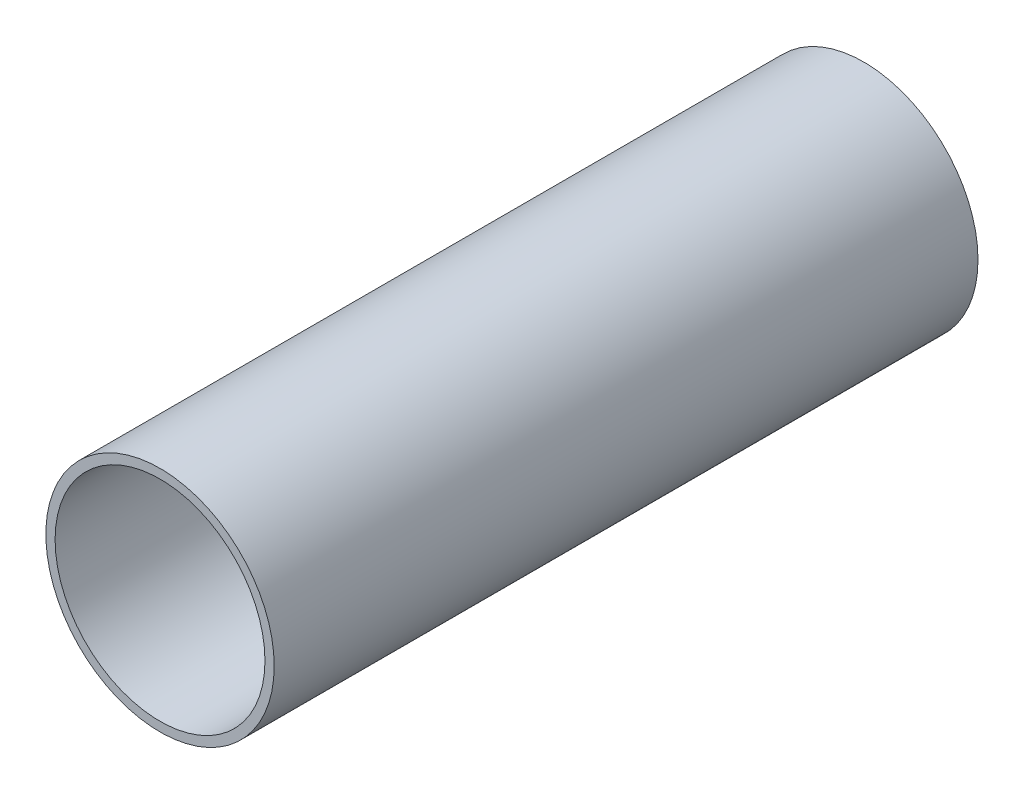
ISO-10303-21;
HEADER;
FILE_DESCRIPTION(('STEP AP214'),'2;1');
FILE_NAME('part.step','',(''),(''),'','','');
FILE_SCHEMA(('AUTOMOTIVE_DESIGN { 1 0 10303 214 1 1 1 1 }'));
ENDSEC;
DATA;
#1=APPLICATION_CONTEXT('core data for automotive mechanical design processes');
#2=APPLICATION_PROTOCOL_DEFINITION('international standard','automotive_design',2000,#1);
#3=PRODUCT_CONTEXT('',#1,'mechanical');
#4=PRODUCT('Part','Part','',(#3));
#5=PRODUCT_RELATED_PRODUCT_CATEGORY('part','',(#4));
#6=PRODUCT_DEFINITION_FORMATION('','',#4);
#7=PRODUCT_DEFINITION_CONTEXT('part definition',#1,'design');
#8=PRODUCT_DEFINITION('design','',#6,#7);
#9=PRODUCT_DEFINITION_SHAPE('','',#8);
#10=(LENGTH_UNIT() NAMED_UNIT(*) SI_UNIT(.MILLI.,.METRE.));
#11=(NAMED_UNIT(*) PLANE_ANGLE_UNIT() SI_UNIT($,.RADIAN.));
#12=(NAMED_UNIT(*) SI_UNIT($,.STERADIAN.) SOLID_ANGLE_UNIT());
#13=UNCERTAINTY_MEASURE_WITH_UNIT(LENGTH_MEASURE(1.E-05),#10,'distance_accuracy_value','');
#14=(GEOMETRIC_REPRESENTATION_CONTEXT(3) GLOBAL_UNCERTAINTY_ASSIGNED_CONTEXT((#13)) GLOBAL_UNIT_ASSIGNED_CONTEXT((#10,
#11,#12)) REPRESENTATION_CONTEXT('',''));
#15=CARTESIAN_POINT('',(0.,0.,0.));
#16=DIRECTION('',(0.,0.,1.));
#17=DIRECTION('',(1.,0.,0.));
#18=AXIS2_PLACEMENT_3D('',#15,#16,#17);
#19=CARTESIAN_POINT('',(0.,0.,53.229999919));
#20=DIRECTION('',(0.,0.,1.));
#21=DIRECTION('',(1.,0.,0.));
#22=AXIS2_PLACEMENT_3D('',#19,#20,#21);
#23=PLANE('',#22);
#24=CARTESIAN_POINT('',(0.,0.,53.229999919));
#25=DIRECTION('',(0.,0.,1.));
#26=DIRECTION('',(1.,0.,0.));
#27=AXIS2_PLACEMENT_3D('',#24,#25,#26);
#28=CIRCLE('',#27,17.272);
#29=CARTESIAN_POINT('',(17.272,0.,53.229999919));
#30=VERTEX_POINT('',#29);
#31=EDGE_CURVE('E10',#30,#30,#28,.T.);
#32=ORIENTED_EDGE('',*,*,#31,.T.);
#33=EDGE_LOOP('',(#32));
#34=FACE_BOUND('',#33,.T.);
#35=CARTESIAN_POINT('',(0.,0.,53.229999919));
#36=DIRECTION('',(0.,0.,1.));
#37=DIRECTION('',(1.,0.,0.));
#38=AXIS2_PLACEMENT_3D('',#35,#36,#37);
#39=CIRCLE('',#38,15.875);
#40=CARTESIAN_POINT('',(15.875,0.,53.229999919));
#41=VERTEX_POINT('',#40);
#42=EDGE_CURVE('E51',#41,#41,#39,.T.);
#43=ORIENTED_EDGE('',*,*,#42,.F.);
#44=EDGE_LOOP('',(#43));
#45=FACE_BOUND('',#44,.T.);
#46=ADVANCED_FACE('F43',(#34,#45),#23,.T.);
#47=CARTESIAN_POINT('',(0.,0.,53.229999919));
#48=DIRECTION('',(0.,0.,-1.));
#49=DIRECTION('',(-1.,0.,0.));
#50=AXIS2_PLACEMENT_3D('',#47,#48,#49);
#51=CYLINDRICAL_SURFACE('',#50,17.272);
#52=ORIENTED_EDGE('',*,*,#31,.F.);
#53=EDGE_LOOP('',(#52));
#54=FACE_BOUND('',#53,.T.);
#55=CARTESIAN_POINT('',(0.,0.,-53.229999919));
#56=DIRECTION('',(0.,0.,1.));
#57=DIRECTION('',(1.,0.,0.));
#58=AXIS2_PLACEMENT_3D('',#55,#56,#57);
#59=CIRCLE('',#58,17.272);
#60=CARTESIAN_POINT('',(17.272,0.,-53.229999919));
#61=VERTEX_POINT('',#60);
#62=EDGE_CURVE('E56',#61,#61,#59,.T.);
#63=ORIENTED_EDGE('',*,*,#62,.T.);
#64=EDGE_LOOP('',(#63));
#65=FACE_BOUND('',#64,.T.);
#66=ADVANCED_FACE('F45',(#54,#65),#51,.T.);
#67=CARTESIAN_POINT('',(0.,0.,53.229999919));
#68=DIRECTION('',(0.,0.,-1.));
#69=DIRECTION('',(-1.,0.,0.));
#70=AXIS2_PLACEMENT_3D('',#67,#68,#69);
#71=CYLINDRICAL_SURFACE('',#70,15.875);
#72=ORIENTED_EDGE('',*,*,#42,.T.);
#73=EDGE_LOOP('',(#72));
#74=FACE_BOUND('',#73,.T.);
#75=CARTESIAN_POINT('',(0.,0.,-53.229999919));
#76=DIRECTION('',(0.,0.,1.));
#77=DIRECTION('',(1.,0.,0.));
#78=AXIS2_PLACEMENT_3D('',#75,#76,#77);
#79=CIRCLE('',#78,15.875);
#80=CARTESIAN_POINT('',(15.875,0.,-53.229999919));
#81=VERTEX_POINT('',#80);
#82=EDGE_CURVE('E61',#81,#81,#79,.T.);
#83=ORIENTED_EDGE('',*,*,#82,.F.);
#84=EDGE_LOOP('',(#83));
#85=FACE_BOUND('',#84,.T.);
#86=ADVANCED_FACE('F71',(#74,#85),#71,.F.);
#87=CARTESIAN_POINT('',(0.,0.,-53.229999919));
#88=DIRECTION('',(0.,0.,1.));
#89=DIRECTION('',(1.,0.,0.));
#90=AXIS2_PLACEMENT_3D('',#87,#88,#89);
#91=PLANE('',#90);
#92=ORIENTED_EDGE('',*,*,#82,.T.);
#93=EDGE_LOOP('',(#92));
#94=FACE_BOUND('',#93,.T.);
#95=ORIENTED_EDGE('',*,*,#62,.F.);
#96=EDGE_LOOP('',(#95));
#97=FACE_BOUND('',#96,.T.);
#98=ADVANCED_FACE('F68',(#94,#97),#91,.F.);
#99=CLOSED_SHELL('',(#46,#66,#86,#98));
#100=MANIFOLD_SOLID_BREP('B2',#99);
#101=ADVANCED_BREP_SHAPE_REPRESENTATION('',(#18,#100),#14);
#102=SHAPE_DEFINITION_REPRESENTATION(#9,#101);
ENDSEC;
END-ISO-10303-21;
